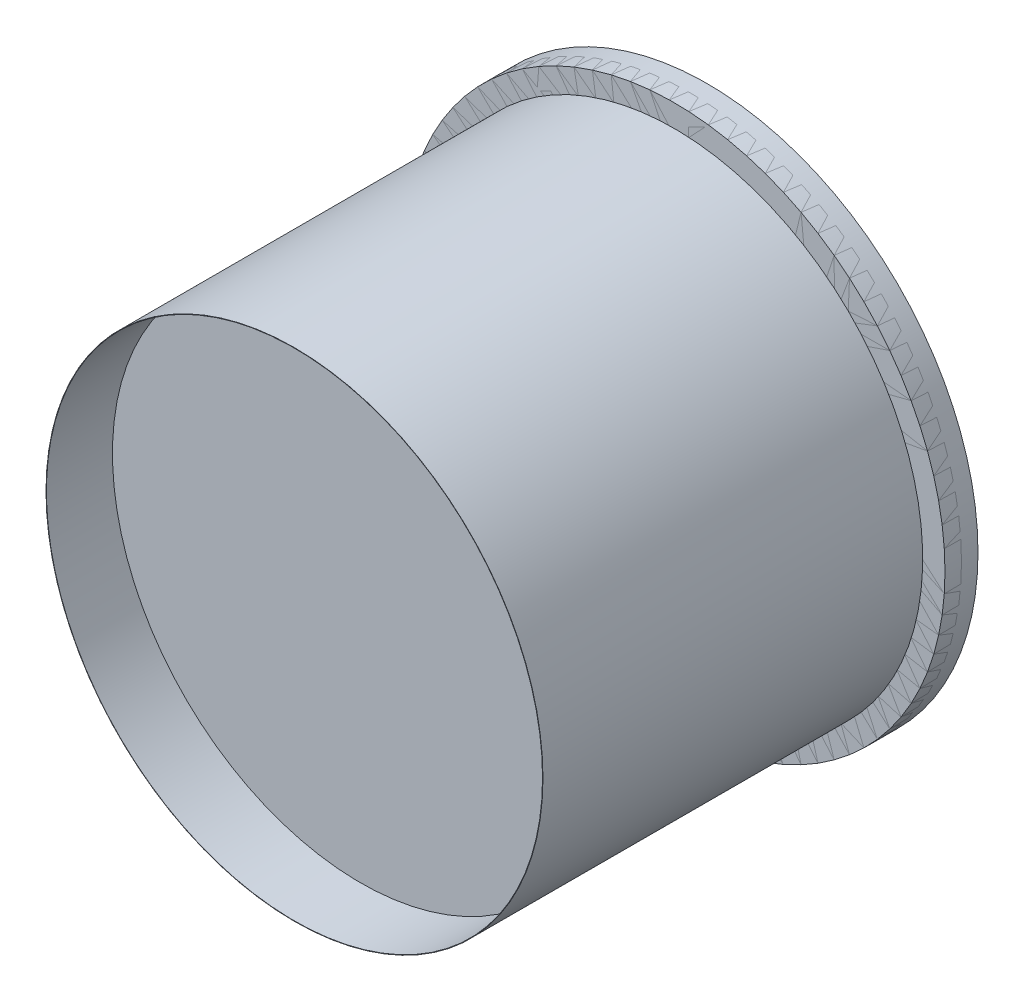
ISO-10303-21;
HEADER;
FILE_DESCRIPTION(('STEP AP214'),'2;1');
FILE_NAME('part.step','',(''),(''),'','','');
FILE_SCHEMA(('AUTOMOTIVE_DESIGN { 1 0 10303 214 1 1 1 1 }'));
ENDSEC;
DATA;
#1=APPLICATION_CONTEXT('core data for automotive mechanical design processes');
#2=APPLICATION_PROTOCOL_DEFINITION('international standard','automotive_design',2000,#1);
#3=PRODUCT_CONTEXT('',#1,'mechanical');
#4=PRODUCT('Part','Part','',(#3));
#5=PRODUCT_RELATED_PRODUCT_CATEGORY('part','',(#4));
#6=PRODUCT_DEFINITION_FORMATION('','',#4);
#7=PRODUCT_DEFINITION_CONTEXT('part definition',#1,'design');
#8=PRODUCT_DEFINITION('design','',#6,#7);
#9=PRODUCT_DEFINITION_SHAPE('','',#8);
#10=(LENGTH_UNIT() NAMED_UNIT(*) SI_UNIT(.MILLI.,.METRE.));
#11=(NAMED_UNIT(*) PLANE_ANGLE_UNIT() SI_UNIT($,.RADIAN.));
#12=(NAMED_UNIT(*) SI_UNIT($,.STERADIAN.) SOLID_ANGLE_UNIT());
#13=UNCERTAINTY_MEASURE_WITH_UNIT(LENGTH_MEASURE(1.E-05),#10,'distance_accuracy_value','');
#14=(GEOMETRIC_REPRESENTATION_CONTEXT(3) GLOBAL_UNCERTAINTY_ASSIGNED_CONTEXT((#13)) GLOBAL_UNIT_ASSIGNED_CONTEXT((#10,
#11,#12)) REPRESENTATION_CONTEXT('',''));
#15=CARTESIAN_POINT('',(0.,0.,0.));
#16=DIRECTION('',(0.,0.,1.));
#17=DIRECTION('',(1.,0.,0.));
#18=AXIS2_PLACEMENT_3D('',#15,#16,#17);
#19=CARTESIAN_POINT('',(0.,0.,-8.5));
#20=DIRECTION('',(0.,0.,1.));
#21=DIRECTION('',(1.,0.,0.));
#22=AXIS2_PLACEMENT_3D('',#19,#20,#21);
#23=CYLINDRICAL_SURFACE('',#22,16.4);
#24=CARTESIAN_POINT('',(0.,0.,-6.5));
#25=DIRECTION('',(0.,0.,-1.));
#26=DIRECTION('',(1.,0.,0.));
#27=AXIS2_PLACEMENT_3D('',#24,#25,#26);
#28=CIRCLE('',#27,16.4);
#29=CARTESIAN_POINT('',(16.4,0.,-6.5));
#30=VERTEX_POINT('',#29);
#31=EDGE_CURVE('P0_E63',#30,#30,#28,.T.);
#32=ORIENTED_EDGE('',*,*,#31,.T.);
#33=EDGE_LOOP('',(#32));
#34=FACE_BOUND('',#33,.T.);
#35=CARTESIAN_POINT('',(0.,0.,-7.5));
#36=DIRECTION('',(0.,0.,-1.));
#37=DIRECTION('',(-1.,0.,0.));
#38=AXIS2_PLACEMENT_3D('',#35,#36,#37);
#39=CIRCLE('',#38,16.4);
#40=CARTESIAN_POINT('',(-16.4,0.,-7.5));
#41=VERTEX_POINT('',#40);
#42=EDGE_CURVE('P0_E67',#41,#41,#39,.T.);
#43=ORIENTED_EDGE('',*,*,#42,.F.);
#44=EDGE_LOOP('',(#43));
#45=FACE_BOUND('',#44,.T.);
#46=ADVANCED_FACE('P0_F47',(#34,#45),#23,.T.);
#47=CARTESIAN_POINT('',(0.,0.,-6.5));
#48=DIRECTION('',(0.,0.,-1.));
#49=DIRECTION('',(0.,-1.,0.));
#50=AXIS2_PLACEMENT_3D('',#47,#48,#49);
#51=PLANE('',#50);
#52=CARTESIAN_POINT('',(0.,0.,-6.5));
#53=DIRECTION('',(0.,0.,-1.));
#54=DIRECTION('',(-1.,0.,0.));
#55=AXIS2_PLACEMENT_3D('',#52,#53,#54);
#56=CIRCLE('',#55,15.05);
#57=CARTESIAN_POINT('',(-15.05,0.,-6.5));
#58=VERTEX_POINT('',#57);
#59=EDGE_CURVE('P0_E11',#58,#58,#56,.F.);
#60=ORIENTED_EDGE('',*,*,#59,.F.);
#61=EDGE_LOOP('',(#60));
#62=FACE_BOUND('',#61,.T.);
#63=ORIENTED_EDGE('',*,*,#31,.F.);
#64=EDGE_LOOP('',(#63));
#65=FACE_BOUND('',#64,.T.);
#66=ADVANCED_FACE('P0_F49',(#62,#65),#51,.F.);
#67=CARTESIAN_POINT('',(0.,0.,-7.5));
#68=DIRECTION('',(0.,0.,-1.));
#69=DIRECTION('',(-1.,0.,0.));
#70=AXIS2_PLACEMENT_3D('',#67,#68,#69);
#71=PLANE('',#70);
#72=CARTESIAN_POINT('',(0.,0.,-7.5));
#73=DIRECTION('',(0.,0.,-1.));
#74=DIRECTION('',(-1.,0.,0.));
#75=AXIS2_PLACEMENT_3D('',#72,#73,#74);
#76=CIRCLE('',#75,2.55);
#77=CARTESIAN_POINT('',(-2.55,0.,-7.5));
#78=VERTEX_POINT('',#77);
#79=EDGE_CURVE('P0_E55',#78,#78,#76,.T.);
#80=ORIENTED_EDGE('',*,*,#79,.F.);
#81=EDGE_LOOP('',(#80));
#82=FACE_BOUND('',#81,.T.);
#83=ORIENTED_EDGE('',*,*,#42,.T.);
#84=EDGE_LOOP('',(#83));
#85=FACE_BOUND('',#84,.T.);
#86=ADVANCED_FACE('P0_F113',(#82,#85),#71,.T.);
#87=CARTESIAN_POINT('',(0.,0.,-11.5));
#88=DIRECTION('',(0.,0.,1.));
#89=DIRECTION('',(1.,0.,0.));
#90=AXIS2_PLACEMENT_3D('',#87,#88,#89);
#91=CYLINDRICAL_SURFACE('',#90,2.55);
#92=CARTESIAN_POINT('',(0.,0.,-11.5));
#93=DIRECTION('',(0.,0.,-1.));
#94=DIRECTION('',(-1.,0.,0.));
#95=AXIS2_PLACEMENT_3D('',#92,#93,#94);
#96=CIRCLE('',#95,2.55);
#97=CARTESIAN_POINT('',(-2.55,0.,-11.5));
#98=VERTEX_POINT('',#97);
#99=EDGE_CURVE('P0_E74',#98,#98,#96,.T.);
#100=ORIENTED_EDGE('',*,*,#99,.F.);
#101=EDGE_LOOP('',(#100));
#102=FACE_BOUND('',#101,.T.);
#103=ORIENTED_EDGE('',*,*,#79,.T.);
#104=EDGE_LOOP('',(#103));
#105=FACE_BOUND('',#104,.T.);
#106=ADVANCED_FACE('P0_F118',(#102,#105),#91,.T.);
#107=CARTESIAN_POINT('',(0.,0.,-11.5));
#108=DIRECTION('',(0.,0.,-1.));
#109=DIRECTION('',(-1.,0.,0.));
#110=AXIS2_PLACEMENT_3D('',#107,#108,#109);
#111=PLANE('',#110);
#112=ORIENTED_EDGE('',*,*,#99,.T.);
#113=EDGE_LOOP('',(#112));
#114=FACE_BOUND('',#113,.T.);
#115=ADVANCED_FACE('P0_F122',(#114),#111,.T.);
#116=CARTESIAN_POINT('',(0.,0.,16.5));
#117=DIRECTION('',(0.,0.,-1.));
#118=DIRECTION('',(-1.,0.,0.));
#119=AXIS2_PLACEMENT_3D('',#116,#117,#118);
#120=CYLINDRICAL_SURFACE('',#119,15.05);
#121=CARTESIAN_POINT('',(0.,0.,16.5));
#122=DIRECTION('',(0.,0.,1.));
#123=DIRECTION('',(1.,0.,0.));
#124=AXIS2_PLACEMENT_3D('',#121,#122,#123);
#125=CIRCLE('',#124,15.05);
#126=CARTESIAN_POINT('',(15.05,0.,16.5));
#127=VERTEX_POINT('',#126);
#128=EDGE_CURVE('P0_E80',#127,#127,#125,.T.);
#129=ORIENTED_EDGE('',*,*,#128,.F.);
#130=EDGE_LOOP('',(#129));
#131=FACE_BOUND('',#130,.T.);
#132=ORIENTED_EDGE('',*,*,#59,.T.);
#133=EDGE_LOOP('',(#132));
#134=FACE_BOUND('',#133,.T.);
#135=ADVANCED_FACE('P0_F105',(#131,#134),#120,.T.);
#136=CARTESIAN_POINT('',(0.,0.,16.5));
#137=DIRECTION('',(0.,0.,1.));
#138=DIRECTION('',(1.,0.,0.));
#139=AXIS2_PLACEMENT_3D('',#136,#137,#138);
#140=PLANE('',#139);
#141=CARTESIAN_POINT('',(0.,0.,16.5));
#142=DIRECTION('',(0.,0.,1.));
#143=DIRECTION('',(1.,0.,0.));
#144=AXIS2_PLACEMENT_3D('',#141,#142,#143);
#145=CIRCLE('',#144,15.025);
#146=CARTESIAN_POINT('',(15.025,0.,16.5));
#147=VERTEX_POINT('',#146);
#148=EDGE_CURVE('P0_E84',#147,#147,#145,.T.);
#149=ORIENTED_EDGE('',*,*,#148,.F.);
#150=EDGE_LOOP('',(#149));
#151=FACE_BOUND('',#150,.T.);
#152=ORIENTED_EDGE('',*,*,#128,.T.);
#153=EDGE_LOOP('',(#152));
#154=FACE_BOUND('',#153,.T.);
#155=ADVANCED_FACE('P0_F97',(#151,#154),#140,.T.);
#156=CARTESIAN_POINT('',(0.,0.,14.5));
#157=DIRECTION('',(0.,0.,1.));
#158=DIRECTION('',(1.,0.,0.));
#159=AXIS2_PLACEMENT_3D('',#156,#157,#158);
#160=CYLINDRICAL_SURFACE('',#159,15.025);
#161=ORIENTED_EDGE('',*,*,#148,.T.);
#162=EDGE_LOOP('',(#161));
#163=FACE_BOUND('',#162,.T.);
#164=CARTESIAN_POINT('',(0.,0.,12.5));
#165=DIRECTION('',(0.,0.,1.));
#166=DIRECTION('',(1.,0.,0.));
#167=AXIS2_PLACEMENT_3D('',#164,#165,#166);
#168=CIRCLE('',#167,15.025);
#169=CARTESIAN_POINT('',(15.025,0.,12.5));
#170=VERTEX_POINT('',#169);
#171=EDGE_CURVE('P0_E88',#170,#170,#168,.T.);
#172=ORIENTED_EDGE('',*,*,#171,.F.);
#173=EDGE_LOOP('',(#172));
#174=FACE_BOUND('',#173,.T.);
#175=ADVANCED_FACE('P0_F95',(#163,#174),#160,.F.);
#176=CARTESIAN_POINT('',(0.,0.,12.5));
#177=DIRECTION('',(0.,0.,1.));
#178=DIRECTION('',(1.,0.,0.));
#179=AXIS2_PLACEMENT_3D('',#176,#177,#178);
#180=PLANE('',#179);
#181=ORIENTED_EDGE('',*,*,#171,.T.);
#182=EDGE_LOOP('',(#181));
#183=FACE_BOUND('',#182,.T.);
#184=ADVANCED_FACE('P0_F93',(#183),#180,.T.);
#185=CLOSED_SHELL('',(#46,#66,#86,#106,#115,#135,#155,#175,#184));
#186=MANIFOLD_SOLID_BREP('P0_B2',#185);
#187=CARTESIAN_POINT('',(0.,13.5,8.5));
#188=DIRECTION('',(0.,0.,1.));
#189=DIRECTION('',(1.,0.,0.));
#190=AXIS2_PLACEMENT_3D('',#187,#188,#189);
#191=CONICAL_SURFACE('',#190,1.25,0.785398162500002);
#192=CARTESIAN_POINT('',(0.,13.5,8.5));
#193=DIRECTION('',(0.,0.,-1.));
#194=DIRECTION('',(1.,0.,0.));
#195=AXIS2_PLACEMENT_3D('',#192,#193,#194);
#196=CIRCLE('',#195,1.25);
#197=CARTESIAN_POINT('',(1.25000000000005,13.5,8.5));
#198=VERTEX_POINT('',#197);
#199=EDGE_CURVE('P1_E20',#198,#198,#196,.T.);
#200=ORIENTED_EDGE('',*,*,#199,.F.);
#201=EDGE_LOOP('',(#200));
#202=FACE_BOUND('',#201,.T.);
#203=CARTESIAN_POINT('',(0.,13.5,8.275));
#204=DIRECTION('',(0.,0.,1.));
#205=DIRECTION('',(1.,0.,0.));
#206=AXIS2_PLACEMENT_3D('',#203,#204,#205);
#207=CIRCLE('',#206,1.025);
#208=CARTESIAN_POINT('',(1.02500000000005,13.5,8.275));
#209=VERTEX_POINT('',#208);
#210=EDGE_CURVE('P1_E11',#209,#209,#207,.T.);
#211=ORIENTED_EDGE('',*,*,#210,.F.);
#212=EDGE_LOOP('',(#211));
#213=FACE_BOUND('',#212,.T.);
#214=ADVANCED_FACE('P1_F16',(#202,#213),#191,.F.);
#215=CARTESIAN_POINT('',(0.,13.5,8.5));
#216=DIRECTION('',(0.,0.,-1.));
#217=DIRECTION('',(-1.,0.,0.));
#218=AXIS2_PLACEMENT_3D('',#215,#216,#217);
#219=CYLINDRICAL_SURFACE('',#218,1.025);
#220=CARTESIAN_POINT('',(0.,13.5,3.5));
#221=DIRECTION('',(0.,0.,1.));
#222=DIRECTION('',(-1.,0.,0.));
#223=AXIS2_PLACEMENT_3D('',#220,#221,#222);
#224=CIRCLE('',#223,1.025);
#225=CARTESIAN_POINT('',(-1.02499999999995,13.5,3.5));
#226=VERTEX_POINT('',#225);
#227=EDGE_CURVE('P1_E27',#226,#226,#224,.T.);
#228=ORIENTED_EDGE('',*,*,#227,.F.);
#229=EDGE_LOOP('',(#228));
#230=FACE_BOUND('',#229,.T.);
#231=ORIENTED_EDGE('',*,*,#210,.T.);
#232=EDGE_LOOP('',(#231));
#233=FACE_BOUND('',#232,.T.);
#234=ADVANCED_FACE('P1_F212',(#230,#233),#219,.F.);
#235=CARTESIAN_POINT('',(0.,13.5,3.5));
#236=DIRECTION('',(0.,0.,1.));
#237=DIRECTION('',(1.,0.,0.));
#238=AXIS2_PLACEMENT_3D('',#235,#236,#237);
#239=CONICAL_SURFACE('',#238,1.025,1.0297442575);
#240=CARTESIAN_POINT('',(0.,13.5,2.88411786549675));
#241=VERTEX_POINT('',#240);
#242=VERTEX_LOOP('',#241);
#243=FACE_BOUND('',#242,.T.);
#244=ORIENTED_EDGE('',*,*,#227,.T.);
#245=EDGE_LOOP('',(#244));
#246=FACE_BOUND('',#245,.T.);
#247=ADVANCED_FACE('P1_F218',(#243,#246),#239,.F.);
#248=CARTESIAN_POINT('',(13.5,0.,8.5));
#249=DIRECTION('',(0.,0.,1.));
#250=DIRECTION('',(1.,0.,0.));
#251=AXIS2_PLACEMENT_3D('',#248,#249,#250);
#252=CONICAL_SURFACE('',#251,1.25,0.7853981625);
#253=CARTESIAN_POINT('',(13.5,0.,8.5));
#254=DIRECTION('',(0.,0.,-1.));
#255=DIRECTION('',(1.,0.,0.));
#256=AXIS2_PLACEMENT_3D('',#253,#254,#255);
#257=CIRCLE('',#256,1.25);
#258=CARTESIAN_POINT('',(14.75,0.,8.5));
#259=VERTEX_POINT('',#258);
#260=EDGE_CURVE('P1_E167',#259,#259,#257,.T.);
#261=ORIENTED_EDGE('',*,*,#260,.F.);
#262=EDGE_LOOP('',(#261));
#263=FACE_BOUND('',#262,.T.);
#264=CARTESIAN_POINT('',(13.5,0.,8.275));
#265=DIRECTION('',(0.,0.,1.));
#266=DIRECTION('',(1.,0.,0.));
#267=AXIS2_PLACEMENT_3D('',#264,#265,#266);
#268=CIRCLE('',#267,1.025);
#269=CARTESIAN_POINT('',(14.525,0.,8.275));
#270=VERTEX_POINT('',#269);
#271=EDGE_CURVE('P1_E121',#270,#270,#268,.T.);
#272=ORIENTED_EDGE('',*,*,#271,.F.);
#273=EDGE_LOOP('',(#272));
#274=FACE_BOUND('',#273,.T.);
#275=ADVANCED_FACE('P1_F223',(#263,#274),#252,.F.);
#276=CARTESIAN_POINT('',(13.5,0.,8.5));
#277=DIRECTION('',(0.,0.,-1.));
#278=DIRECTION('',(-1.,0.,0.));
#279=AXIS2_PLACEMENT_3D('',#276,#277,#278);
#280=CYLINDRICAL_SURFACE('',#279,1.025);
#281=CARTESIAN_POINT('',(13.5,0.,3.5));
#282=DIRECTION('',(0.,0.,1.));
#283=DIRECTION('',(-1.,0.,0.));
#284=AXIS2_PLACEMENT_3D('',#281,#282,#283);
#285=CIRCLE('',#284,1.025);
#286=CARTESIAN_POINT('',(12.475,0.,3.5));
#287=VERTEX_POINT('',#286);
#288=EDGE_CURVE('P1_E125',#287,#287,#285,.T.);
#289=ORIENTED_EDGE('',*,*,#288,.F.);
#290=EDGE_LOOP('',(#289));
#291=FACE_BOUND('',#290,.T.);
#292=ORIENTED_EDGE('',*,*,#271,.T.);
#293=EDGE_LOOP('',(#292));
#294=FACE_BOUND('',#293,.T.);
#295=ADVANCED_FACE('P1_F122',(#291,#294),#280,.F.);
#296=CARTESIAN_POINT('',(13.5,0.,3.5));
#297=DIRECTION('',(0.,0.,1.));
#298=DIRECTION('',(1.,0.,0.));
#299=AXIS2_PLACEMENT_3D('',#296,#297,#298);
#300=CONICAL_SURFACE('',#299,1.025,1.0297442575);
#301=CARTESIAN_POINT('',(13.5,0.,2.88411786549675));
#302=VERTEX_POINT('',#301);
#303=VERTEX_LOOP('',#302);
#304=FACE_BOUND('',#303,.T.);
#305=ORIENTED_EDGE('',*,*,#288,.T.);
#306=EDGE_LOOP('',(#305));
#307=FACE_BOUND('',#306,.T.);
#308=ADVANCED_FACE('P1_F18',(#304,#307),#300,.F.);
#309=CARTESIAN_POINT('',(0.,-13.5,8.5));
#310=DIRECTION('',(0.,0.,1.));
#311=DIRECTION('',(1.,0.,0.));
#312=AXIS2_PLACEMENT_3D('',#309,#310,#311);
#313=CONICAL_SURFACE('',#312,1.25,0.785398162500002);
#314=CARTESIAN_POINT('',(0.,-13.5,8.5));
#315=DIRECTION('',(0.,0.,-1.));
#316=DIRECTION('',(1.,0.,0.));
#317=AXIS2_PLACEMENT_3D('',#314,#315,#316);
#318=CIRCLE('',#317,1.25);
#319=CARTESIAN_POINT('',(1.24999999999998,-13.5,8.5));
#320=VERTEX_POINT('',#319);
#321=EDGE_CURVE('P1_E165',#320,#320,#318,.T.);
#322=ORIENTED_EDGE('',*,*,#321,.F.);
#323=EDGE_LOOP('',(#322));
#324=FACE_BOUND('',#323,.T.);
#325=CARTESIAN_POINT('',(0.,-13.5,8.275));
#326=DIRECTION('',(0.,0.,1.));
#327=DIRECTION('',(1.,0.,0.));
#328=AXIS2_PLACEMENT_3D('',#325,#326,#327);
#329=CIRCLE('',#328,1.025);
#330=CARTESIAN_POINT('',(1.02499999999998,-13.5,8.275));
#331=VERTEX_POINT('',#330);
#332=EDGE_CURVE('P1_E133',#331,#331,#329,.T.);
#333=ORIENTED_EDGE('',*,*,#332,.F.);
#334=EDGE_LOOP('',(#333));
#335=FACE_BOUND('',#334,.T.);
#336=ADVANCED_FACE('P1_F241',(#324,#335),#313,.F.);
#337=CARTESIAN_POINT('',(0.,-13.5,8.5));
#338=DIRECTION('',(0.,0.,-1.));
#339=DIRECTION('',(-1.,0.,0.));
#340=AXIS2_PLACEMENT_3D('',#337,#338,#339);
#341=CYLINDRICAL_SURFACE('',#340,1.025);
#342=CARTESIAN_POINT('',(0.,-13.5,3.5));
#343=DIRECTION('',(0.,0.,1.));
#344=DIRECTION('',(-1.,0.,0.));
#345=AXIS2_PLACEMENT_3D('',#342,#343,#344);
#346=CIRCLE('',#345,1.025);
#347=CARTESIAN_POINT('',(-1.02500000000002,-13.5,3.5));
#348=VERTEX_POINT('',#347);
#349=EDGE_CURVE('P1_E161',#348,#348,#346,.T.);
#350=ORIENTED_EDGE('',*,*,#349,.F.);
#351=EDGE_LOOP('',(#350));
#352=FACE_BOUND('',#351,.T.);
#353=ORIENTED_EDGE('',*,*,#332,.T.);
#354=EDGE_LOOP('',(#353));
#355=FACE_BOUND('',#354,.T.);
#356=ADVANCED_FACE('P1_F237',(#352,#355),#341,.F.);
#357=CARTESIAN_POINT('',(0.,-13.5,3.5));
#358=DIRECTION('',(0.,0.,1.));
#359=DIRECTION('',(1.,0.,0.));
#360=AXIS2_PLACEMENT_3D('',#357,#358,#359);
#361=CONICAL_SURFACE('',#360,1.025,1.0297442575);
#362=CARTESIAN_POINT('',(0.,-13.5,2.88411786549675));
#363=VERTEX_POINT('',#362);
#364=VERTEX_LOOP('',#363);
#365=FACE_BOUND('',#364,.T.);
#366=ORIENTED_EDGE('',*,*,#349,.T.);
#367=EDGE_LOOP('',(#366));
#368=FACE_BOUND('',#367,.T.);
#369=ADVANCED_FACE('P1_F240',(#365,#368),#361,.F.);
#370=CARTESIAN_POINT('',(-13.5,0.,8.5));
#371=DIRECTION('',(0.,0.,1.));
#372=DIRECTION('',(1.,0.,0.));
#373=AXIS2_PLACEMENT_3D('',#370,#371,#372);
#374=CONICAL_SURFACE('',#373,1.25,0.7853981625);
#375=CARTESIAN_POINT('',(-13.5,0.,8.5));
#376=DIRECTION('',(0.,0.,-1.));
#377=DIRECTION('',(1.,0.,0.));
#378=AXIS2_PLACEMENT_3D('',#375,#376,#377);
#379=CIRCLE('',#378,1.25);
#380=CARTESIAN_POINT('',(-12.25,0.,8.5));
#381=VERTEX_POINT('',#380);
#382=EDGE_CURVE('P1_E157',#381,#381,#379,.T.);
#383=ORIENTED_EDGE('',*,*,#382,.F.);
#384=EDGE_LOOP('',(#383));
#385=FACE_BOUND('',#384,.T.);
#386=CARTESIAN_POINT('',(-13.5,0.,8.275));
#387=DIRECTION('',(0.,0.,1.));
#388=DIRECTION('',(1.,0.,0.));
#389=AXIS2_PLACEMENT_3D('',#386,#387,#388);
#390=CIRCLE('',#389,1.025);
#391=CARTESIAN_POINT('',(-12.475,0.,8.275));
#392=VERTEX_POINT('',#391);
#393=EDGE_CURVE('P1_E162',#392,#392,#390,.T.);
#394=ORIENTED_EDGE('',*,*,#393,.F.);
#395=EDGE_LOOP('',(#394));
#396=FACE_BOUND('',#395,.T.);
#397=ADVANCED_FACE('P1_F322',(#385,#396),#374,.F.);
#398=CARTESIAN_POINT('',(-13.5,0.,8.5));
#399=DIRECTION('',(0.,0.,-1.));
#400=DIRECTION('',(-1.,0.,0.));
#401=AXIS2_PLACEMENT_3D('',#398,#399,#400);
#402=CYLINDRICAL_SURFACE('',#401,1.025);
#403=CARTESIAN_POINT('',(-13.5,0.,3.5));
#404=DIRECTION('',(0.,0.,1.));
#405=DIRECTION('',(-1.,0.,0.));
#406=AXIS2_PLACEMENT_3D('',#403,#404,#405);
#407=CIRCLE('',#406,1.025);
#408=CARTESIAN_POINT('',(-14.525,0.,3.5));
#409=VERTEX_POINT('',#408);
#410=EDGE_CURVE('P1_E164',#409,#409,#407,.T.);
#411=ORIENTED_EDGE('',*,*,#410,.F.);
#412=EDGE_LOOP('',(#411));
#413=FACE_BOUND('',#412,.T.);
#414=ORIENTED_EDGE('',*,*,#393,.T.);
#415=EDGE_LOOP('',(#414));
#416=FACE_BOUND('',#415,.T.);
#417=ADVANCED_FACE('P1_F330',(#413,#416),#402,.F.);
#418=CARTESIAN_POINT('',(-13.5,0.,3.5));
#419=DIRECTION('',(0.,0.,1.));
#420=DIRECTION('',(1.,0.,0.));
#421=AXIS2_PLACEMENT_3D('',#418,#419,#420);
#422=CONICAL_SURFACE('',#421,1.025,1.0297442575);
#423=CARTESIAN_POINT('',(-13.5,0.,2.88411786549675));
#424=VERTEX_POINT('',#423);
#425=VERTEX_LOOP('',#424);
#426=FACE_BOUND('',#425,.T.);
#427=ORIENTED_EDGE('',*,*,#410,.T.);
#428=EDGE_LOOP('',(#427));
#429=FACE_BOUND('',#428,.T.);
#430=ADVANCED_FACE('P1_F262',(#426,#429),#422,.F.);
#431=CARTESIAN_POINT('',(0.,0.,-2.5));
#432=DIRECTION('',(0.,0.,-1.));
#433=DIRECTION('',(-1.,0.,0.));
#434=AXIS2_PLACEMENT_3D('',#431,#432,#433);
#435=CYLINDRICAL_SURFACE('',#434,12.);
#436=CARTESIAN_POINT('',(0.,0.,-8.5));
#437=DIRECTION('',(0.,0.,-1.));
#438=DIRECTION('',(1.,0.,0.));
#439=AXIS2_PLACEMENT_3D('',#436,#437,#438);
#440=CIRCLE('',#439,12.);
#441=CARTESIAN_POINT('',(12.,0.,-8.5));
#442=VERTEX_POINT('',#441);
#443=EDGE_CURVE('P1_E139',#442,#442,#440,.T.);
#444=ORIENTED_EDGE('',*,*,#443,.T.);
#445=EDGE_LOOP('',(#444));
#446=FACE_BOUND('',#445,.T.);
#447=CARTESIAN_POINT('',(0.,0.,-2.5));
#448=DIRECTION('',(0.,0.,1.));
#449=DIRECTION('',(1.,0.,0.));
#450=AXIS2_PLACEMENT_3D('',#447,#448,#449);
#451=CIRCLE('',#450,12.);
#452=CARTESIAN_POINT('',(12.,0.,-2.5));
#453=VERTEX_POINT('',#452);
#454=EDGE_CURVE('P1_E265',#453,#453,#451,.T.);
#455=ORIENTED_EDGE('',*,*,#454,.T.);
#456=EDGE_LOOP('',(#455));
#457=FACE_BOUND('',#456,.T.);
#458=ADVANCED_FACE('P1_F259',(#446,#457),#435,.F.);
#459=CARTESIAN_POINT('',(0.,0.,-2.5));
#460=DIRECTION('',(0.,0.,-1.));
#461=DIRECTION('',(0.,-1.,0.));
#462=AXIS2_PLACEMENT_3D('',#459,#460,#461);
#463=PLANE('',#462);
#464=CARTESIAN_POINT('',(0.,0.,-2.5));
#465=DIRECTION('',(0.,0.,1.));
#466=DIRECTION('',(-1.,0.,0.));
#467=AXIS2_PLACEMENT_3D('',#464,#465,#466);
#468=CIRCLE('',#467,11.);
#469=CARTESIAN_POINT('',(-11.,0.,-2.5));
#470=VERTEX_POINT('',#469);
#471=EDGE_CURVE('P1_E177',#470,#470,#468,.T.);
#472=ORIENTED_EDGE('',*,*,#471,.T.);
#473=EDGE_LOOP('',(#472));
#474=FACE_BOUND('',#473,.T.);
#475=ORIENTED_EDGE('',*,*,#454,.F.);
#476=EDGE_LOOP('',(#475));
#477=FACE_BOUND('',#476,.T.);
#478=ADVANCED_FACE('P1_F232',(#474,#477),#463,.T.);
#479=CARTESIAN_POINT('',(0.,0.,2.5));
#480=DIRECTION('',(0.,0.,1.));
#481=DIRECTION('',(1.,0.,0.));
#482=AXIS2_PLACEMENT_3D('',#479,#480,#481);
#483=CYLINDRICAL_SURFACE('',#482,12.);
#484=CARTESIAN_POINT('',(0.,0.,8.5));
#485=DIRECTION('',(0.,0.,1.));
#486=DIRECTION('',(1.,0.,0.));
#487=AXIS2_PLACEMENT_3D('',#484,#485,#486);
#488=CIRCLE('',#487,12.);
#489=CARTESIAN_POINT('',(12.,0.,8.5));
#490=VERTEX_POINT('',#489);
#491=EDGE_CURVE('P1_E149',#490,#490,#488,.T.);
#492=ORIENTED_EDGE('',*,*,#491,.T.);
#493=EDGE_LOOP('',(#492));
#494=FACE_BOUND('',#493,.T.);
#495=CARTESIAN_POINT('',(0.,0.,2.5));
#496=DIRECTION('',(0.,0.,-1.));
#497=DIRECTION('',(1.,0.,0.));
#498=AXIS2_PLACEMENT_3D('',#495,#496,#497);
#499=CIRCLE('',#498,12.);
#500=CARTESIAN_POINT('',(12.,0.,2.5));
#501=VERTEX_POINT('',#500);
#502=EDGE_CURVE('P1_E146',#501,#501,#499,.T.);
#503=ORIENTED_EDGE('',*,*,#502,.T.);
#504=EDGE_LOOP('',(#503));
#505=FACE_BOUND('',#504,.T.);
#506=ADVANCED_FACE('P1_F229',(#494,#505),#483,.F.);
#507=CARTESIAN_POINT('',(0.,0.,2.5));
#508=DIRECTION('',(0.,0.,1.));
#509=DIRECTION('',(1.,0.,0.));
#510=AXIS2_PLACEMENT_3D('',#507,#508,#509);
#511=PLANE('',#510);
#512=CARTESIAN_POINT('',(0.,0.,2.5));
#513=DIRECTION('',(0.,0.,-1.));
#514=DIRECTION('',(1.,0.,0.));
#515=AXIS2_PLACEMENT_3D('',#512,#513,#514);
#516=CIRCLE('',#515,11.);
#517=CARTESIAN_POINT('',(11.,0.,2.5));
#518=VERTEX_POINT('',#517);
#519=EDGE_CURVE('P1_E183',#518,#518,#516,.T.);
#520=ORIENTED_EDGE('',*,*,#519,.T.);
#521=EDGE_LOOP('',(#520));
#522=FACE_BOUND('',#521,.T.);
#523=ORIENTED_EDGE('',*,*,#502,.F.);
#524=EDGE_LOOP('',(#523));
#525=FACE_BOUND('',#524,.T.);
#526=ADVANCED_FACE('P1_F193',(#522,#525),#511,.T.);
#527=CARTESIAN_POINT('',(0.,0.,-6.5));
#528=DIRECTION('',(0.,0.,-1.));
#529=DIRECTION('',(0.,-1.,0.));
#530=AXIS2_PLACEMENT_3D('',#527,#528,#529);
#531=PLANE('',#530);
#532=CARTESIAN_POINT('',(0.,0.,-6.5));
#533=DIRECTION('',(0.,0.,-1.));
#534=DIRECTION('',(1.,0.,0.));
#535=AXIS2_PLACEMENT_3D('',#532,#533,#534);
#536=CIRCLE('',#535,16.4);
#537=CARTESIAN_POINT('',(16.4,0.,-6.5));
#538=VERTEX_POINT('',#537);
#539=EDGE_CURVE('P1_E137',#538,#538,#536,.T.);
#540=ORIENTED_EDGE('',*,*,#539,.F.);
#541=EDGE_LOOP('',(#540));
#542=FACE_BOUND('',#541,.T.);
#543=CARTESIAN_POINT('',(0.,0.,-6.5));
#544=DIRECTION('',(0.,0.,1.));
#545=DIRECTION('',(1.,0.,0.));
#546=AXIS2_PLACEMENT_3D('',#543,#544,#545);
#547=CIRCLE('',#546,15.);
#548=CARTESIAN_POINT('',(15.,0.,-6.5));
#549=VERTEX_POINT('',#548);
#550=EDGE_CURVE('P1_E171',#549,#549,#547,.T.);
#551=ORIENTED_EDGE('',*,*,#550,.F.);
#552=EDGE_LOOP('',(#551));
#553=FACE_BOUND('',#552,.T.);
#554=ADVANCED_FACE('P1_F245',(#542,#553),#531,.F.);
#555=CARTESIAN_POINT('',(0.,0.,-8.5));
#556=DIRECTION('',(0.,0.,-1.));
#557=DIRECTION('',(0.,-1.,0.));
#558=AXIS2_PLACEMENT_3D('',#555,#556,#557);
#559=PLANE('',#558);
#560=CARTESIAN_POINT('',(0.,0.,-8.5));
#561=DIRECTION('',(0.,0.,-1.));
#562=DIRECTION('',(1.,0.,0.));
#563=AXIS2_PLACEMENT_3D('',#560,#561,#562);
#564=CIRCLE('',#563,16.4);
#565=CARTESIAN_POINT('',(16.4,0.,-8.5));
#566=VERTEX_POINT('',#565);
#567=EDGE_CURVE('P1_E140',#566,#566,#564,.T.);
#568=ORIENTED_EDGE('',*,*,#567,.T.);
#569=EDGE_LOOP('',(#568));
#570=FACE_BOUND('',#569,.T.);
#571=ORIENTED_EDGE('',*,*,#443,.F.);
#572=EDGE_LOOP('',(#571));
#573=FACE_BOUND('',#572,.T.);
#574=ADVANCED_FACE('P1_F246',(#570,#573),#559,.T.);
#575=CARTESIAN_POINT('',(0.,0.,-8.5));
#576=DIRECTION('',(0.,0.,1.));
#577=DIRECTION('',(1.,0.,0.));
#578=AXIS2_PLACEMENT_3D('',#575,#576,#577);
#579=CYLINDRICAL_SURFACE('',#578,16.4);
#580=ORIENTED_EDGE('',*,*,#539,.T.);
#581=EDGE_LOOP('',(#580));
#582=FACE_BOUND('',#581,.T.);
#583=ORIENTED_EDGE('',*,*,#567,.F.);
#584=EDGE_LOOP('',(#583));
#585=FACE_BOUND('',#584,.T.);
#586=ADVANCED_FACE('P1_F248',(#582,#585),#579,.T.);
#587=CARTESIAN_POINT('',(0.,0.,8.5));
#588=DIRECTION('',(0.,0.,1.));
#589=DIRECTION('',(1.,0.,0.));
#590=AXIS2_PLACEMENT_3D('',#587,#588,#589);
#591=PLANE('',#590);
#592=CARTESIAN_POINT('',(0.,0.,8.5));
#593=DIRECTION('',(0.,0.,1.));
#594=DIRECTION('',(1.,0.,0.));
#595=AXIS2_PLACEMENT_3D('',#592,#593,#594);
#596=CIRCLE('',#595,15.);
#597=CARTESIAN_POINT('',(15.,0.,8.5));
#598=VERTEX_POINT('',#597);
#599=EDGE_CURVE('P1_E168',#598,#598,#596,.T.);
#600=ORIENTED_EDGE('',*,*,#599,.T.);
#601=EDGE_LOOP('',(#600));
#602=FACE_BOUND('',#601,.T.);
#603=ORIENTED_EDGE('',*,*,#491,.F.);
#604=EDGE_LOOP('',(#603));
#605=FACE_BOUND('',#604,.T.);
#606=ORIENTED_EDGE('',*,*,#382,.T.);
#607=EDGE_LOOP('',(#606));
#608=FACE_BOUND('',#607,.T.);
#609=ORIENTED_EDGE('',*,*,#321,.T.);
#610=EDGE_LOOP('',(#609));
#611=FACE_BOUND('',#610,.T.);
#612=ORIENTED_EDGE('',*,*,#260,.T.);
#613=EDGE_LOOP('',(#612));
#614=FACE_BOUND('',#613,.T.);
#615=ORIENTED_EDGE('',*,*,#199,.T.);
#616=EDGE_LOOP('',(#615));
#617=FACE_BOUND('',#616,.T.);
#618=ADVANCED_FACE('P1_F205',(#602,#605,#608,#611,#614,#617),#591,.T.);
#619=CARTESIAN_POINT('',(0.,0.,-6.5));
#620=DIRECTION('',(0.,0.,1.));
#621=DIRECTION('',(1.,0.,0.));
#622=AXIS2_PLACEMENT_3D('',#619,#620,#621);
#623=CYLINDRICAL_SURFACE('',#622,15.);
#624=ORIENTED_EDGE('',*,*,#599,.F.);
#625=EDGE_LOOP('',(#624));
#626=FACE_BOUND('',#625,.T.);
#627=ORIENTED_EDGE('',*,*,#550,.T.);
#628=EDGE_LOOP('',(#627));
#629=FACE_BOUND('',#628,.T.);
#630=ADVANCED_FACE('P1_F198',(#626,#629),#623,.T.);
#631=CARTESIAN_POINT('',(0.,0.,-6.5));
#632=DIRECTION('',(0.,0.,1.));
#633=DIRECTION('',(1.,0.,0.));
#634=AXIS2_PLACEMENT_3D('',#631,#632,#633);
#635=CYLINDRICAL_SURFACE('',#634,11.);
#636=ORIENTED_EDGE('',*,*,#471,.F.);
#637=EDGE_LOOP('',(#636));
#638=FACE_BOUND('',#637,.T.);
#639=ORIENTED_EDGE('',*,*,#519,.F.);
#640=EDGE_LOOP('',(#639));
#641=FACE_BOUND('',#640,.T.);
#642=ADVANCED_FACE('P1_F196',(#638,#641),#635,.F.);
#643=CLOSED_SHELL('',(#214,#234,#247,#275,#295,#308,#336,#356,#369,#397,#417,#430,#458,#478,
#506,#526,#554,#574,#586,#618,#630,#642));
#644=MANIFOLD_SOLID_BREP('P1_B1',#643);
#645=ADVANCED_BREP_SHAPE_REPRESENTATION('',(#18,#186,#644),#14);
#646=SHAPE_DEFINITION_REPRESENTATION(#9,#645);
ENDSEC;
END-ISO-10303-21;
